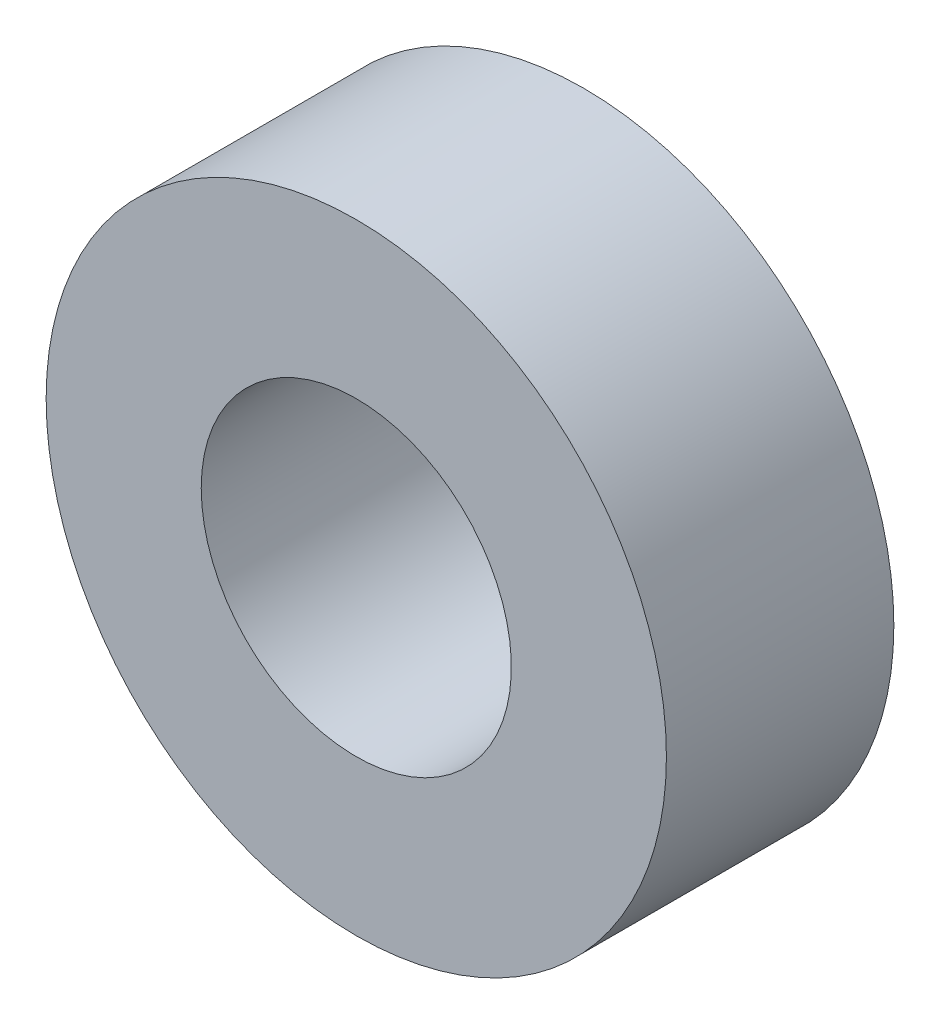
ISO-10303-21;
HEADER;
FILE_DESCRIPTION(('STEP AP214'),'2;1');
FILE_NAME('part.step','',(''),(''),'','','');
FILE_SCHEMA(('AUTOMOTIVE_DESIGN { 1 0 10303 214 1 1 1 1 }'));
ENDSEC;
DATA;
#1=APPLICATION_CONTEXT('core data for automotive mechanical design processes');
#2=APPLICATION_PROTOCOL_DEFINITION('international standard','automotive_design',2000,#1);
#3=PRODUCT_CONTEXT('',#1,'mechanical');
#4=PRODUCT('Part','Part','',(#3));
#5=PRODUCT_RELATED_PRODUCT_CATEGORY('part','',(#4));
#6=PRODUCT_DEFINITION_FORMATION('','',#4);
#7=PRODUCT_DEFINITION_CONTEXT('part definition',#1,'design');
#8=PRODUCT_DEFINITION('design','',#6,#7);
#9=PRODUCT_DEFINITION_SHAPE('','',#8);
#10=(LENGTH_UNIT() NAMED_UNIT(*) SI_UNIT(.MILLI.,.METRE.));
#11=(NAMED_UNIT(*) PLANE_ANGLE_UNIT() SI_UNIT($,.RADIAN.));
#12=(NAMED_UNIT(*) SI_UNIT($,.STERADIAN.) SOLID_ANGLE_UNIT());
#13=UNCERTAINTY_MEASURE_WITH_UNIT(LENGTH_MEASURE(1.E-05),#10,'distance_accuracy_value','');
#14=(GEOMETRIC_REPRESENTATION_CONTEXT(3) GLOBAL_UNCERTAINTY_ASSIGNED_CONTEXT((#13)) GLOBAL_UNIT_ASSIGNED_CONTEXT((#10,
#11,#12)) REPRESENTATION_CONTEXT('',''));
#15=CARTESIAN_POINT('',(0.,0.,0.));
#16=DIRECTION('',(0.,0.,1.));
#17=DIRECTION('',(1.,0.,0.));
#18=AXIS2_PLACEMENT_3D('',#15,#16,#17);
#19=CARTESIAN_POINT('',(0.,0.,0.));
#20=DIRECTION('',(0.,0.,-1.));
#21=DIRECTION('',(-1.,0.,0.));
#22=AXIS2_PLACEMENT_3D('',#19,#20,#21);
#23=CYLINDRICAL_SURFACE('',#22,19.05);
#24=CARTESIAN_POINT('',(0.,0.,13.97));
#25=DIRECTION('',(0.,0.,-1.));
#26=DIRECTION('',(-1.,0.,0.));
#27=AXIS2_PLACEMENT_3D('',#24,#25,#26);
#28=CIRCLE('',#27,19.05);
#29=CARTESIAN_POINT('',(-19.05,0.,13.97));
#30=VERTEX_POINT('',#29);
#31=EDGE_CURVE('E65',#30,#30,#28,.T.);
#32=ORIENTED_EDGE('',*,*,#31,.T.);
#33=EDGE_LOOP('',(#32));
#34=FACE_BOUND('',#33,.T.);
#35=CARTESIAN_POINT('',(0.,0.,0.));
#36=DIRECTION('',(0.,0.,-1.));
#37=DIRECTION('',(-1.,0.,0.));
#38=AXIS2_PLACEMENT_3D('',#35,#36,#37);
#39=CIRCLE('',#38,19.05);
#40=CARTESIAN_POINT('',(-19.05,0.,0.));
#41=VERTEX_POINT('',#40);
#42=EDGE_CURVE('E12',#41,#41,#39,.T.);
#43=ORIENTED_EDGE('',*,*,#42,.F.);
#44=EDGE_LOOP('',(#43));
#45=FACE_BOUND('',#44,.T.);
#46=ADVANCED_FACE('F51',(#34,#45),#23,.T.);
#47=CARTESIAN_POINT('',(-19.05,0.,0.));
#48=DIRECTION('',(0.,0.,-1.));
#49=DIRECTION('',(-1.,0.,0.));
#50=AXIS2_PLACEMENT_3D('',#47,#48,#49);
#51=PLANE('',#50);
#52=ORIENTED_EDGE('',*,*,#42,.T.);
#53=EDGE_LOOP('',(#52));
#54=FACE_BOUND('',#53,.T.);
#55=CARTESIAN_POINT('',(0.,0.,0.));
#56=DIRECTION('',(0.,0.,-1.));
#57=DIRECTION('',(-1.,0.,0.));
#58=AXIS2_PLACEMENT_3D('',#55,#56,#57);
#59=CIRCLE('',#58,9.525);
#60=CARTESIAN_POINT('',(-9.525,0.,0.));
#61=VERTEX_POINT('',#60);
#62=EDGE_CURVE('E57',#61,#61,#59,.T.);
#63=ORIENTED_EDGE('',*,*,#62,.F.);
#64=EDGE_LOOP('',(#63));
#65=FACE_BOUND('',#64,.T.);
#66=ADVANCED_FACE('F81',(#54,#65),#51,.T.);
#67=CARTESIAN_POINT('',(0.,0.,0.));
#68=DIRECTION('',(0.,0.,-1.));
#69=DIRECTION('',(-1.,0.,0.));
#70=AXIS2_PLACEMENT_3D('',#67,#68,#69);
#71=CYLINDRICAL_SURFACE('',#70,9.525);
#72=ORIENTED_EDGE('',*,*,#62,.T.);
#73=EDGE_LOOP('',(#72));
#74=FACE_BOUND('',#73,.T.);
#75=CARTESIAN_POINT('',(0.,0.,13.97));
#76=DIRECTION('',(0.,0.,-1.));
#77=DIRECTION('',(-1.,0.,0.));
#78=AXIS2_PLACEMENT_3D('',#75,#76,#77);
#79=CIRCLE('',#78,9.525);
#80=CARTESIAN_POINT('',(-9.525,0.,13.97));
#81=VERTEX_POINT('',#80);
#82=EDGE_CURVE('E61',#81,#81,#79,.T.);
#83=ORIENTED_EDGE('',*,*,#82,.F.);
#84=EDGE_LOOP('',(#83));
#85=FACE_BOUND('',#84,.T.);
#86=ADVANCED_FACE('F75',(#74,#85),#71,.F.);
#87=CARTESIAN_POINT('',(-9.525,0.,13.97));
#88=DIRECTION('',(0.,0.,1.));
#89=DIRECTION('',(1.,0.,0.));
#90=AXIS2_PLACEMENT_3D('',#87,#88,#89);
#91=PLANE('',#90);
#92=ORIENTED_EDGE('',*,*,#82,.T.);
#93=EDGE_LOOP('',(#92));
#94=FACE_BOUND('',#93,.T.);
#95=ORIENTED_EDGE('',*,*,#31,.F.);
#96=EDGE_LOOP('',(#95));
#97=FACE_BOUND('',#96,.T.);
#98=ADVANCED_FACE('F73',(#94,#97),#91,.T.);
#99=CLOSED_SHELL('',(#46,#66,#86,#98));
#100=MANIFOLD_SOLID_BREP('B2',#99);
#101=ADVANCED_BREP_SHAPE_REPRESENTATION('',(#18,#100),#14);
#102=SHAPE_DEFINITION_REPRESENTATION(#9,#101);
ENDSEC;
END-ISO-10303-21;
